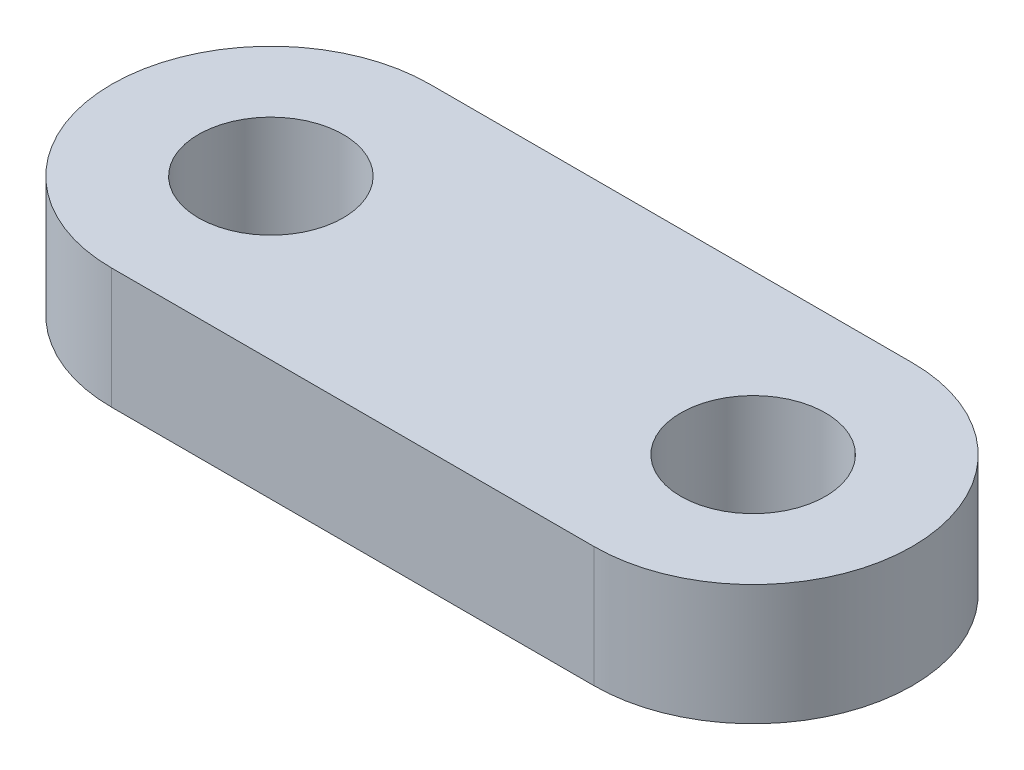
ISO-10303-21;
HEADER;
FILE_DESCRIPTION(('STEP AP214'),'2;1');
FILE_NAME('part.step','',(''),(''),'','','');
FILE_SCHEMA(('AUTOMOTIVE_DESIGN { 1 0 10303 214 1 1 1 1 }'));
ENDSEC;
DATA;
#1=APPLICATION_CONTEXT('core data for automotive mechanical design processes');
#2=APPLICATION_PROTOCOL_DEFINITION('international standard','automotive_design',2000,#1);
#3=PRODUCT_CONTEXT('',#1,'mechanical');
#4=PRODUCT('Part','Part','',(#3));
#5=PRODUCT_RELATED_PRODUCT_CATEGORY('part','',(#4));
#6=PRODUCT_DEFINITION_FORMATION('','',#4);
#7=PRODUCT_DEFINITION_CONTEXT('part definition',#1,'design');
#8=PRODUCT_DEFINITION('design','',#6,#7);
#9=PRODUCT_DEFINITION_SHAPE('','',#8);
#10=(LENGTH_UNIT() NAMED_UNIT(*) SI_UNIT(.MILLI.,.METRE.));
#11=(NAMED_UNIT(*) PLANE_ANGLE_UNIT() SI_UNIT($,.RADIAN.));
#12=(NAMED_UNIT(*) SI_UNIT($,.STERADIAN.) SOLID_ANGLE_UNIT());
#13=UNCERTAINTY_MEASURE_WITH_UNIT(LENGTH_MEASURE(1.E-05),#10,'distance_accuracy_value','');
#14=(GEOMETRIC_REPRESENTATION_CONTEXT(3) GLOBAL_UNCERTAINTY_ASSIGNED_CONTEXT((#13)) GLOBAL_UNIT_ASSIGNED_CONTEXT((#10,
#11,#12)) REPRESENTATION_CONTEXT('',''));
#15=CARTESIAN_POINT('',(0.,0.,0.));
#16=DIRECTION('',(0.,0.,1.));
#17=DIRECTION('',(1.,0.,0.));
#18=AXIS2_PLACEMENT_3D('',#15,#16,#17);
#19=CARTESIAN_POINT('',(0.,12.7,16.764));
#20=DIRECTION('',(0.,0.,-1.));
#21=DIRECTION('',(-1.,0.,0.));
#22=AXIS2_PLACEMENT_3D('',#19,#20,#21);
#23=PLANE('',#22);
#24=DIRECTION('',(1.,0.,0.));
#25=VECTOR('',#24,1.);
#26=CARTESIAN_POINT('',(0.,0.,16.764));
#27=LINE('',#26,#25);
#28=CARTESIAN_POINT('',(0.,0.,16.764));
#29=VERTEX_POINT('',#28);
#30=CARTESIAN_POINT('',(50.8,0.,16.764));
#31=VERTEX_POINT('',#30);
#32=EDGE_CURVE('E117',#29,#31,#27,.T.);
#33=ORIENTED_EDGE('',*,*,#32,.T.);
#34=DIRECTION('',(0.,-1.,0.));
#35=VECTOR('',#34,1.);
#36=CARTESIAN_POINT('',(50.8,12.7,16.764));
#37=LINE('',#36,#35);
#38=CARTESIAN_POINT('',(50.8,12.7,16.764));
#39=VERTEX_POINT('',#38);
#40=EDGE_CURVE('E11',#39,#31,#37,.T.);
#41=ORIENTED_EDGE('',*,*,#40,.F.);
#42=DIRECTION('',(1.,0.,0.));
#43=VECTOR('',#42,1.);
#44=CARTESIAN_POINT('',(0.,12.7,16.764));
#45=LINE('',#44,#43);
#46=CARTESIAN_POINT('',(0.,12.7,16.764));
#47=VERTEX_POINT('',#46);
#48=EDGE_CURVE('E90',#47,#39,#45,.T.);
#49=ORIENTED_EDGE('',*,*,#48,.F.);
#50=DIRECTION('',(0.,-1.,0.));
#51=VECTOR('',#50,1.);
#52=CARTESIAN_POINT('',(0.,12.7,16.764));
#53=LINE('',#52,#51);
#54=EDGE_CURVE('E105',#47,#29,#53,.T.);
#55=ORIENTED_EDGE('',*,*,#54,.T.);
#56=EDGE_LOOP('',(#33,#41,#49,#55));
#57=FACE_BOUND('',#56,.T.);
#58=ADVANCED_FACE('F41',(#57),#23,.F.);
#59=CARTESIAN_POINT('',(50.8,12.7,0.));
#60=DIRECTION('',(0.,-1.,0.));
#61=DIRECTION('',(0.,0.,-1.));
#62=AXIS2_PLACEMENT_3D('',#59,#60,#61);
#63=CYLINDRICAL_SURFACE('',#62,16.764);
#64=CARTESIAN_POINT('',(50.8,0.,0.));
#65=DIRECTION('',(0.,1.,0.));
#66=DIRECTION('',(0.,0.,1.));
#67=AXIS2_PLACEMENT_3D('',#64,#65,#66);
#68=CIRCLE('',#67,16.764);
#69=CARTESIAN_POINT('',(50.8,0.,-16.764));
#70=VERTEX_POINT('',#69);
#71=EDGE_CURVE('E96',#31,#70,#68,.T.);
#72=ORIENTED_EDGE('',*,*,#71,.T.);
#73=DIRECTION('',(0.,-1.,0.));
#74=VECTOR('',#73,1.);
#75=CARTESIAN_POINT('',(50.8,12.7,-16.764));
#76=LINE('',#75,#74);
#77=CARTESIAN_POINT('',(50.8,12.7,-16.764));
#78=VERTEX_POINT('',#77);
#79=EDGE_CURVE('E51',#78,#70,#76,.T.);
#80=ORIENTED_EDGE('',*,*,#79,.F.);
#81=CARTESIAN_POINT('',(50.8,12.7,0.));
#82=DIRECTION('',(0.,1.,0.));
#83=DIRECTION('',(0.,0.,1.));
#84=AXIS2_PLACEMENT_3D('',#81,#82,#83);
#85=CIRCLE('',#84,16.764);
#86=EDGE_CURVE('E85',#39,#78,#85,.T.);
#87=ORIENTED_EDGE('',*,*,#86,.F.);
#88=ORIENTED_EDGE('',*,*,#40,.T.);
#89=EDGE_LOOP('',(#72,#80,#87,#88));
#90=FACE_BOUND('',#89,.T.);
#91=ADVANCED_FACE('F95',(#90),#63,.T.);
#92=CARTESIAN_POINT('',(0.,12.7,-16.764));
#93=DIRECTION('',(0.,0.,-1.));
#94=DIRECTION('',(-1.,0.,0.));
#95=AXIS2_PLACEMENT_3D('',#92,#93,#94);
#96=PLANE('',#95);
#97=DIRECTION('',(1.,0.,0.));
#98=VECTOR('',#97,1.);
#99=CARTESIAN_POINT('',(0.,0.,-16.764));
#100=LINE('',#99,#98);
#101=CARTESIAN_POINT('',(0.,0.,-16.764));
#102=VERTEX_POINT('',#101);
#103=EDGE_CURVE('E123',#102,#70,#100,.T.);
#104=ORIENTED_EDGE('',*,*,#103,.F.);
#105=DIRECTION('',(0.,-1.,0.));
#106=VECTOR('',#105,1.);
#107=CARTESIAN_POINT('',(0.,12.7,-16.764));
#108=LINE('',#107,#106);
#109=CARTESIAN_POINT('',(0.,12.7,-16.764));
#110=VERTEX_POINT('',#109);
#111=EDGE_CURVE('E75',#110,#102,#108,.T.);
#112=ORIENTED_EDGE('',*,*,#111,.F.);
#113=DIRECTION('',(1.,0.,0.));
#114=VECTOR('',#113,1.);
#115=CARTESIAN_POINT('',(0.,12.7,-16.764));
#116=LINE('',#115,#114);
#117=EDGE_CURVE('E88',#110,#78,#116,.T.);
#118=ORIENTED_EDGE('',*,*,#117,.T.);
#119=ORIENTED_EDGE('',*,*,#79,.T.);
#120=EDGE_LOOP('',(#104,#112,#118,#119));
#121=FACE_BOUND('',#120,.T.);
#122=ADVANCED_FACE('F101',(#121),#96,.T.);
#123=CARTESIAN_POINT('',(0.,12.7,0.));
#124=DIRECTION('',(0.,-1.,0.));
#125=DIRECTION('',(0.,0.,-1.));
#126=AXIS2_PLACEMENT_3D('',#123,#124,#125);
#127=CYLINDRICAL_SURFACE('',#126,7.62);
#128=CARTESIAN_POINT('',(0.,12.7,0.));
#129=DIRECTION('',(0.,1.,0.));
#130=DIRECTION('',(0.,0.,1.));
#131=AXIS2_PLACEMENT_3D('',#128,#129,#130);
#132=CIRCLE('',#131,7.62);
#133=CARTESIAN_POINT('',(0.,12.7,7.62));
#134=VERTEX_POINT('',#133);
#135=EDGE_CURVE('E165',#134,#134,#132,.T.);
#136=ORIENTED_EDGE('',*,*,#135,.T.);
#137=EDGE_LOOP('',(#136));
#138=FACE_BOUND('',#137,.T.);
#139=CARTESIAN_POINT('',(0.,0.,0.));
#140=DIRECTION('',(0.,1.,0.));
#141=DIRECTION('',(0.,0.,1.));
#142=AXIS2_PLACEMENT_3D('',#139,#140,#141);
#143=CIRCLE('',#142,7.62);
#144=CARTESIAN_POINT('',(0.,0.,7.62));
#145=VERTEX_POINT('',#144);
#146=EDGE_CURVE('E113',#145,#145,#143,.T.);
#147=ORIENTED_EDGE('',*,*,#146,.F.);
#148=EDGE_LOOP('',(#147));
#149=FACE_BOUND('',#148,.T.);
#150=ADVANCED_FACE('F154',(#138,#149),#127,.F.);
#151=CARTESIAN_POINT('',(50.8,12.7,0.));
#152=DIRECTION('',(0.,-1.,0.));
#153=DIRECTION('',(0.,0.,-1.));
#154=AXIS2_PLACEMENT_3D('',#151,#152,#153);
#155=CYLINDRICAL_SURFACE('',#154,7.62);
#156=CARTESIAN_POINT('',(50.8,12.7,0.));
#157=DIRECTION('',(0.,1.,0.));
#158=DIRECTION('',(0.,0.,1.));
#159=AXIS2_PLACEMENT_3D('',#156,#157,#158);
#160=CIRCLE('',#159,7.62);
#161=CARTESIAN_POINT('',(50.8,12.7,7.62));
#162=VERTEX_POINT('',#161);
#163=EDGE_CURVE('E128',#162,#162,#160,.T.);
#164=ORIENTED_EDGE('',*,*,#163,.T.);
#165=EDGE_LOOP('',(#164));
#166=FACE_BOUND('',#165,.T.);
#167=CARTESIAN_POINT('',(50.8,0.,0.));
#168=DIRECTION('',(0.,1.,0.));
#169=DIRECTION('',(0.,0.,1.));
#170=AXIS2_PLACEMENT_3D('',#167,#168,#169);
#171=CIRCLE('',#170,7.62);
#172=CARTESIAN_POINT('',(50.8,0.,7.62));
#173=VERTEX_POINT('',#172);
#174=EDGE_CURVE('E109',#173,#173,#171,.T.);
#175=ORIENTED_EDGE('',*,*,#174,.F.);
#176=EDGE_LOOP('',(#175));
#177=FACE_BOUND('',#176,.T.);
#178=ADVANCED_FACE('F43',(#166,#177),#155,.F.);
#179=CARTESIAN_POINT('',(0.,12.7,0.));
#180=DIRECTION('',(0.,-1.,0.));
#181=DIRECTION('',(0.,0.,-1.));
#182=AXIS2_PLACEMENT_3D('',#179,#180,#181);
#183=CYLINDRICAL_SURFACE('',#182,16.764);
#184=CARTESIAN_POINT('',(0.,0.,0.));
#185=DIRECTION('',(0.,1.,0.));
#186=DIRECTION('',(0.,0.,1.));
#187=AXIS2_PLACEMENT_3D('',#184,#185,#186);
#188=CIRCLE('',#187,16.764);
#189=EDGE_CURVE('E78',#102,#29,#188,.T.);
#190=ORIENTED_EDGE('',*,*,#189,.T.);
#191=ORIENTED_EDGE('',*,*,#54,.F.);
#192=CARTESIAN_POINT('',(0.,12.7,0.));
#193=DIRECTION('',(0.,1.,0.));
#194=DIRECTION('',(0.,0.,1.));
#195=AXIS2_PLACEMENT_3D('',#192,#193,#194);
#196=CIRCLE('',#195,16.764);
#197=EDGE_CURVE('E59',#110,#47,#196,.T.);
#198=ORIENTED_EDGE('',*,*,#197,.F.);
#199=ORIENTED_EDGE('',*,*,#111,.T.);
#200=EDGE_LOOP('',(#190,#191,#198,#199));
#201=FACE_BOUND('',#200,.T.);
#202=ADVANCED_FACE('F142',(#201),#183,.T.);
#203=CARTESIAN_POINT('',(0.,12.7,0.));
#204=DIRECTION('',(0.,1.,0.));
#205=DIRECTION('',(0.,0.,1.));
#206=AXIS2_PLACEMENT_3D('',#203,#204,#205);
#207=PLANE('',#206);
#208=ORIENTED_EDGE('',*,*,#163,.F.);
#209=EDGE_LOOP('',(#208));
#210=FACE_BOUND('',#209,.T.);
#211=ORIENTED_EDGE('',*,*,#135,.F.);
#212=EDGE_LOOP('',(#211));
#213=FACE_BOUND('',#212,.T.);
#214=ORIENTED_EDGE('',*,*,#48,.T.);
#215=ORIENTED_EDGE('',*,*,#86,.T.);
#216=ORIENTED_EDGE('',*,*,#117,.F.);
#217=ORIENTED_EDGE('',*,*,#197,.T.);
#218=EDGE_LOOP('',(#214,#215,#216,#217));
#219=FACE_BOUND('',#218,.T.);
#220=ADVANCED_FACE('F86',(#210,#213,#219),#207,.T.);
#221=CARTESIAN_POINT('',(0.,0.,0.));
#222=DIRECTION('',(0.,1.,0.));
#223=DIRECTION('',(0.,0.,1.));
#224=AXIS2_PLACEMENT_3D('',#221,#222,#223);
#225=PLANE('',#224);
#226=ORIENTED_EDGE('',*,*,#174,.T.);
#227=EDGE_LOOP('',(#226));
#228=FACE_BOUND('',#227,.T.);
#229=ORIENTED_EDGE('',*,*,#146,.T.);
#230=EDGE_LOOP('',(#229));
#231=FACE_BOUND('',#230,.T.);
#232=ORIENTED_EDGE('',*,*,#32,.F.);
#233=ORIENTED_EDGE('',*,*,#189,.F.);
#234=ORIENTED_EDGE('',*,*,#103,.T.);
#235=ORIENTED_EDGE('',*,*,#71,.F.);
#236=EDGE_LOOP('',(#232,#233,#234,#235));
#237=FACE_BOUND('',#236,.T.);
#238=ADVANCED_FACE('F135',(#228,#231,#237),#225,.F.);
#239=CLOSED_SHELL('',(#58,#91,#122,#150,#178,#202,#220,#238));
#240=MANIFOLD_SOLID_BREP('B2',#239);
#241=ADVANCED_BREP_SHAPE_REPRESENTATION('',(#18,#240),#14);
#242=SHAPE_DEFINITION_REPRESENTATION(#9,#241);
ENDSEC;
END-ISO-10303-21;
